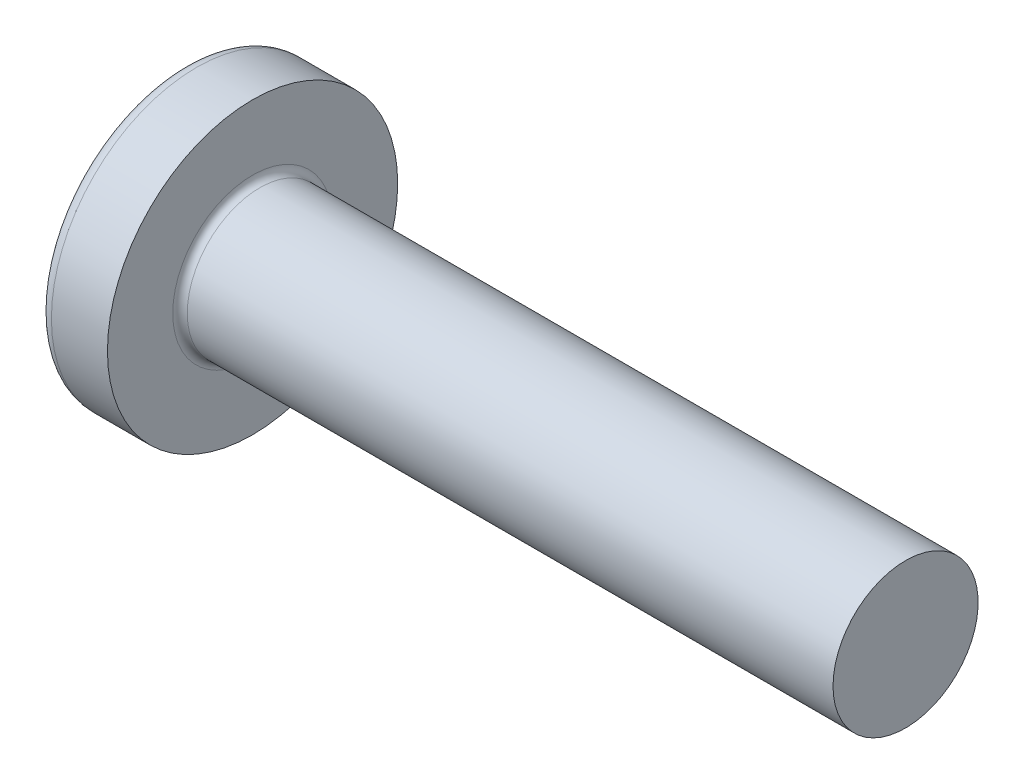
ISO-10303-21;
HEADER;
FILE_DESCRIPTION(('STEP AP214'),'2;1');
FILE_NAME('part.step','',(''),(''),'','','');
FILE_SCHEMA(('AUTOMOTIVE_DESIGN { 1 0 10303 214 1 1 1 1 }'));
ENDSEC;
DATA;
#1=APPLICATION_CONTEXT('core data for automotive mechanical design processes');
#2=APPLICATION_PROTOCOL_DEFINITION('international standard','automotive_design',2000,#1);
#3=PRODUCT_CONTEXT('',#1,'mechanical');
#4=PRODUCT('Part','Part','',(#3));
#5=PRODUCT_RELATED_PRODUCT_CATEGORY('part','',(#4));
#6=PRODUCT_DEFINITION_FORMATION('','',#4);
#7=PRODUCT_DEFINITION_CONTEXT('part definition',#1,'design');
#8=PRODUCT_DEFINITION('design','',#6,#7);
#9=PRODUCT_DEFINITION_SHAPE('','',#8);
#10=(LENGTH_UNIT() NAMED_UNIT(*) SI_UNIT(.MILLI.,.METRE.));
#11=(NAMED_UNIT(*) PLANE_ANGLE_UNIT() SI_UNIT($,.RADIAN.));
#12=(NAMED_UNIT(*) SI_UNIT($,.STERADIAN.) SOLID_ANGLE_UNIT());
#13=UNCERTAINTY_MEASURE_WITH_UNIT(LENGTH_MEASURE(1.E-05),#10,'distance_accuracy_value','');
#14=(GEOMETRIC_REPRESENTATION_CONTEXT(3) GLOBAL_UNCERTAINTY_ASSIGNED_CONTEXT((#13)) GLOBAL_UNIT_ASSIGNED_CONTEXT((#10,
#11,#12)) REPRESENTATION_CONTEXT('',''));
#15=CARTESIAN_POINT('',(0.,0.,0.));
#16=DIRECTION('',(0.,0.,1.));
#17=DIRECTION('',(1.,0.,0.));
#18=AXIS2_PLACEMENT_3D('',#15,#16,#17);
#19=CARTESIAN_POINT('',(6.5,0.,0.));
#20=DIRECTION('',(-1.,0.,0.));
#21=DIRECTION('',(0.,1.,0.));
#22=AXIS2_PLACEMENT_3D('',#19,#20,#21);
#23=SPHERICAL_SURFACE('',#22,6.5);
#24=CARTESIAN_POINT('',(1.26538895452803,0.,0.));
#25=DIRECTION('',(-1.,0.,0.));
#26=DIRECTION('',(0.,0.,1.));
#27=AXIS2_PLACEMENT_3D('',#24,#25,#26);
#28=CIRCLE('',#27,3.85342019543974);
#29=CARTESIAN_POINT('',(1.26538895452803,0.,3.85342019543974));
#30=VERTEX_POINT('',#29);
#31=EDGE_CURVE('E213',#30,#30,#28,.T.);
#32=ORIENTED_EDGE('',*,*,#31,.T.);
#33=EDGE_LOOP('',(#32));
#34=FACE_BOUND('',#33,.T.);
#35=CARTESIAN_POINT('',(0.0788099820016241,0.,0.));
#36=DIRECTION('',(1.,0.,0.));
#37=DIRECTION('',(0.,0.,-1.));
#38=AXIS2_PLACEMENT_3D('',#35,#36,#37);
#39=CIRCLE('',#38,1.0091178091571);
#40=CARTESIAN_POINT('',(0.0788099820016244,-0.514999999999996,-0.867809744562728));
#41=VERTEX_POINT('',#40);
#42=CARTESIAN_POINT('',(0.0788099820016241,-0.867809744562729,-0.515));
#43=VERTEX_POINT('',#42);
#44=EDGE_CURVE('E339',#41,#43,#39,.F.);
#45=ORIENTED_EDGE('',*,*,#44,.F.);
#46=CARTESIAN_POINT('',(6.5,-0.515000000000001,0.));
#47=DIRECTION('',(0.,1.,0.));
#48=DIRECTION('',(0.,0.,1.));
#49=AXIS2_PLACEMENT_3D('',#46,#47,#48);
#50=CIRCLE('',#49,6.47956595768575);
#51=CARTESIAN_POINT('',(0.331830520157854,-0.514999999999992,-1.98455543332603));
#52=VERTEX_POINT('',#51);
#53=EDGE_CURVE('E273',#52,#41,#50,.T.);
#54=ORIENTED_EDGE('',*,*,#53,.F.);
#55=CARTESIAN_POINT('',(6.06443225879603,0.,0.873613881878153));
#56=DIRECTION('',(0.446197753347436,0.,-0.894934391398443));
#57=DIRECTION('',(-0.894934391398442,0.,-0.446197753347436));
#58=AXIS2_PLACEMENT_3D('',#55,#56,#57);
#59=CIRCLE('',#58,6.42628038045433);
#60=CARTESIAN_POINT('',(0.331830520157856,0.515000000000007,-1.98455543332603));
#61=VERTEX_POINT('',#60);
#62=EDGE_CURVE('E247',#52,#61,#59,.T.);
#63=ORIENTED_EDGE('',*,*,#62,.T.);
#64=CARTESIAN_POINT('',(6.5,0.515,0.));
#65=DIRECTION('',(0.,-1.,0.));
#66=DIRECTION('',(0.,0.,-1.));
#67=AXIS2_PLACEMENT_3D('',#64,#65,#66);
#68=CIRCLE('',#67,6.47956595768574);
#69=CARTESIAN_POINT('',(0.0788099820016249,0.515000000000003,-0.867809744562724));
#70=VERTEX_POINT('',#69);
#71=EDGE_CURVE('E301',#70,#61,#68,.T.);
#72=ORIENTED_EDGE('',*,*,#71,.F.);
#73=CARTESIAN_POINT('',(0.0788099820016241,0.867809744562719,-0.515));
#74=VERTEX_POINT('',#73);
#75=EDGE_CURVE('E354',#74,#70,#39,.F.);
#76=ORIENTED_EDGE('',*,*,#75,.F.);
#77=CARTESIAN_POINT('',(6.5,0.,-0.515));
#78=DIRECTION('',(0.,0.,1.));
#79=DIRECTION('',(1.,0.,0.));
#80=AXIS2_PLACEMENT_3D('',#77,#78,#79);
#81=CIRCLE('',#80,6.47956595768574);
#82=CARTESIAN_POINT('',(0.331830520157856,1.98455543332603,-0.515));
#83=VERTEX_POINT('',#82);
#84=EDGE_CURVE('E241',#83,#74,#81,.T.);
#85=ORIENTED_EDGE('',*,*,#84,.F.);
#86=CARTESIAN_POINT('',(6.06443225879604,-0.873613881878154,0.));
#87=DIRECTION('',(0.446197753347436,0.894934391398443,0.));
#88=DIRECTION('',(-0.894934391398442,0.446197753347436,0.));
#89=AXIS2_PLACEMENT_3D('',#86,#87,#88);
#90=CIRCLE('',#89,6.42628038045433);
#91=CARTESIAN_POINT('',(0.331830520157857,1.98455543332603,0.515));
#92=VERTEX_POINT('',#91);
#93=EDGE_CURVE('E244',#83,#92,#90,.T.);
#94=ORIENTED_EDGE('',*,*,#93,.T.);
#95=CARTESIAN_POINT('',(6.5,0.,0.515000000000001));
#96=DIRECTION('',(0.,0.,-1.));
#97=DIRECTION('',(-1.,0.,0.));
#98=AXIS2_PLACEMENT_3D('',#95,#96,#97);
#99=CIRCLE('',#98,6.47956595768574);
#100=CARTESIAN_POINT('',(0.0788099820016241,0.867809744562719,0.514999999999999));
#101=VERTEX_POINT('',#100);
#102=EDGE_CURVE('E237',#101,#92,#99,.T.);
#103=ORIENTED_EDGE('',*,*,#102,.F.);
#104=CARTESIAN_POINT('',(0.0788099820016253,0.514999999999997,0.867809744562727));
#105=VERTEX_POINT('',#104);
#106=EDGE_CURVE('E353',#105,#101,#39,.F.);
#107=ORIENTED_EDGE('',*,*,#106,.F.);
#108=CARTESIAN_POINT('',(0.331830520157856,0.514999999999993,1.98455543332603));
#109=VERTEX_POINT('',#108);
#110=EDGE_CURVE('E257',#109,#105,#68,.T.);
#111=ORIENTED_EDGE('',*,*,#110,.F.);
#112=CARTESIAN_POINT('',(6.06443225879603,0.,-0.873613881878153));
#113=DIRECTION('',(0.446197753347436,0.,0.894934391398443));
#114=DIRECTION('',(0.894934391398442,0.,-0.446197753347436));
#115=AXIS2_PLACEMENT_3D('',#112,#113,#114);
#116=CIRCLE('',#115,6.42628038045433);
#117=CARTESIAN_POINT('',(0.331830520157855,-0.515000000000007,1.98455543332603));
#118=VERTEX_POINT('',#117);
#119=EDGE_CURVE('E48',#109,#118,#116,.T.);
#120=ORIENTED_EDGE('',*,*,#119,.T.);
#121=CARTESIAN_POINT('',(0.0788099820016247,-0.515000000000003,0.867809744562724));
#122=VERTEX_POINT('',#121);
#123=EDGE_CURVE('E254',#122,#118,#50,.T.);
#124=ORIENTED_EDGE('',*,*,#123,.F.);
#125=CARTESIAN_POINT('',(0.0788099820016241,-0.867809744562729,0.514999999999999));
#126=VERTEX_POINT('',#125);
#127=EDGE_CURVE('E385',#126,#122,#39,.F.);
#128=ORIENTED_EDGE('',*,*,#127,.F.);
#129=CARTESIAN_POINT('',(0.331830520157853,-1.98455543332603,0.514999999999999));
#130=VERTEX_POINT('',#129);
#131=EDGE_CURVE('E238',#130,#126,#99,.T.);
#132=ORIENTED_EDGE('',*,*,#131,.F.);
#133=CARTESIAN_POINT('',(6.06443225879603,0.873613881878152,0.));
#134=DIRECTION('',(0.446197753347436,-0.894934391398443,0.));
#135=DIRECTION('',(0.894934391398442,0.446197753347436,0.));
#136=AXIS2_PLACEMENT_3D('',#133,#134,#135);
#137=CIRCLE('',#136,6.42628038045433);
#138=CARTESIAN_POINT('',(0.331830520157853,-1.98455543332603,-0.515));
#139=VERTEX_POINT('',#138);
#140=EDGE_CURVE('E234',#130,#139,#137,.T.);
#141=ORIENTED_EDGE('',*,*,#140,.T.);
#142=EDGE_CURVE('E63',#43,#139,#81,.T.);
#143=ORIENTED_EDGE('',*,*,#142,.F.);
#144=EDGE_LOOP('',(#45,#54,#63,#72,#76,#85,#94,#103,#107,#111,#120,#124,#128,#132,#141,#143));
#145=FACE_BOUND('',#144,.T.);
#146=ADVANCED_FACE('F35',(#34,#145),#23,.T.);
#147=CARTESIAN_POINT('',(0.,2.15,-0.515));
#148=DIRECTION('',(0.,0.,1.));
#149=DIRECTION('',(1.,0.,0.));
#150=AXIS2_PLACEMENT_3D('',#147,#148,#149);
#151=PLANE('',#150);
#152=ORIENTED_EDGE('',*,*,#84,.T.);
#153=CARTESIAN_POINT('',(-1.51195208675156,0.994972220320188,-0.515));
#154=CARTESIAN_POINT('',(-1.20405981949279,0.970722016949958,-0.515));
#155=CARTESIAN_POINT('',(-0.896180907521174,0.946299109919651,-0.515));
#156=CARTESIAN_POINT('',(-0.280449079832185,0.896981122427851,-0.515));
#157=CARTESIAN_POINT('',(0.0274038344396873,0.872086023934883,-0.515));
#158=CARTESIAN_POINT('',(0.489146739515351,0.83429553519528,-0.515));
#159=CARTESIAN_POINT('',(0.643055047553846,0.821624058404092,-0.515));
#160=CARTESIAN_POINT('',(0.950856520197141,0.796108332639504,-0.515));
#161=CARTESIAN_POINT('',(1.10474968487868,0.783264084592465,-0.515));
#162=CARTESIAN_POINT('',(1.41251352095103,0.757376569093378,-0.515));
#163=CARTESIAN_POINT('',(1.56638419296577,0.744333309065218,-0.515));
#164=CARTESIAN_POINT('',(1.87410847343335,0.718013273188896,-0.515));
#165=CARTESIAN_POINT('',(2.02796208151372,0.704736492982792,-0.515));
#166=CARTESIAN_POINT('',(2.36455311890989,0.675386943006726,-0.515));
#167=CARTESIAN_POINT('',(2.54728562293342,0.659257575640986,-0.515));
#168=CARTESIAN_POINT('',(2.91270624109256,0.626517182479888,-0.515));
#169=CARTESIAN_POINT('',(3.09539435554038,0.609906160177238,-0.515));
#170=CARTESIAN_POINT('',(3.46069832191612,0.576073027116421,-0.515));
#171=CARTESIAN_POINT('',(3.64331417870068,0.558850968932727,-0.515));
#172=CARTESIAN_POINT('',(4.00847437496567,0.523604864540037,-0.515));
#173=CARTESIAN_POINT('',(4.19101871216888,0.505580794604253,-0.515));
#174=CARTESIAN_POINT('',(4.55606208157937,0.468429191666488,-0.515));
#175=CARTESIAN_POINT('',(4.73856107358022,0.449301262281854,-0.515));
#176=CARTESIAN_POINT('',(5.10337547353418,0.409473604748924,-0.515));
#177=CARTESIAN_POINT('',(5.28569089526422,0.388774005106069,-0.515));
#178=CARTESIAN_POINT('',(5.55897278495412,0.355828287527264,-0.515));
#179=CARTESIAN_POINT('',(5.65005277419686,0.344527918782738,-0.515));
#180=CARTESIAN_POINT('',(5.83209904103607,0.321075174263031,-0.515));
#181=CARTESIAN_POINT('',(5.92306532397915,0.308922840209686,-0.515));
#182=CARTESIAN_POINT('',(6.10486078872898,0.28342733445193,-0.515));
#183=CARTESIAN_POINT('',(6.19568992299379,0.270083817601714,-0.515));
#184=CARTESIAN_POINT('',(6.33172773785679,0.248701420809951,-0.515));
#185=CARTESIAN_POINT('',(6.37704304473344,0.241345446705304,-0.515));
#186=CARTESIAN_POINT('',(6.4675722520141,0.226018953559337,-0.515));
#187=CARTESIAN_POINT('',(6.51278614568083,0.218048394864476,-0.515));
#188=CARTESIAN_POINT('',(6.55793125759548,0.209691465274944,-0.515));
#189=B_SPLINE_CURVE_WITH_KNOTS('',3,(#153,#154,#155,#156,#157,#158,#159,#160,#161,#162,#163,
#164,#165,#166,#167,#168,#169,#170,#171,#172,#173,#174,#175,#176,#177,#178,#179,#180,#181,#182,
#183,#184,#185,#186,#187,#188),.UNSPECIFIED.,.F.,.F.,(4,2,2,2,2,2,2,2,2,2,2,2,2,2,2,2,2,4),(0.,
0.926537709781721,1.85311087258339,2.31639796016285,2.77968256468771,3.24294992902055,
3.70622594801777,4.25655436065378,4.80687878359543,5.35715597005738,5.90744944680718,
6.45794177197673,7.008389135274,7.28372117336898,7.55903973750591,7.83443833587748,
7.97216007460854,8.10989070671571),.UNSPECIFIED.);
#190=CARTESIAN_POINT('',(2.34,0.677477674908923,-0.515));
#191=VERTEX_POINT('',#190);
#192=EDGE_CURVE('E374',#74,#191,#189,.T.);
#193=ORIENTED_EDGE('',*,*,#192,.T.);
#194=DIRECTION('',(0.,1.,0.));
#195=VECTOR('',#194,1.);
#196=CARTESIAN_POINT('',(2.34,-0.983319232260742,-0.515));
#197=LINE('',#196,#195);
#198=CARTESIAN_POINT('',(2.34,0.983319232260743,-0.515));
#199=VERTEX_POINT('',#198);
#200=EDGE_CURVE('E322',#191,#199,#197,.T.);
#201=ORIENTED_EDGE('',*,*,#200,.T.);
#202=DIRECTION('',(0.894934391398442,-0.446197753347436,0.));
#203=VECTOR('',#202,1.);
#204=CARTESIAN_POINT('',(0.,2.15,-0.515));
#205=LINE('',#204,#203);
#206=EDGE_CURVE('E214',#83,#199,#205,.T.);
#207=ORIENTED_EDGE('',*,*,#206,.F.);
#208=EDGE_LOOP('',(#152,#193,#201,#207));
#209=FACE_BOUND('',#208,.T.);
#210=ADVANCED_FACE('F169',(#209),#151,.T.);
#211=CARTESIAN_POINT('',(2.34,-0.983319232260742,-0.515));
#212=VERTEX_POINT('',#211);
#213=CARTESIAN_POINT('',(2.34,-0.677477674908923,-0.515));
#214=VERTEX_POINT('',#213);
#215=EDGE_CURVE('E222',#212,#214,#197,.T.);
#216=ORIENTED_EDGE('',*,*,#215,.T.);
#217=CARTESIAN_POINT('',(-1.51195208675156,-0.994972220320188,-0.515));
#218=CARTESIAN_POINT('',(-1.20405981949279,-0.970722016949958,-0.515));
#219=CARTESIAN_POINT('',(-0.896180907521174,-0.946299109919651,-0.515));
#220=CARTESIAN_POINT('',(-0.280449079832185,-0.896981122427851,-0.515));
#221=CARTESIAN_POINT('',(0.027403834439687,-0.872086023934883,-0.515));
#222=CARTESIAN_POINT('',(0.48914673951535,-0.83429553519528,-0.515));
#223=CARTESIAN_POINT('',(0.643055047553845,-0.821624058404092,-0.515));
#224=CARTESIAN_POINT('',(0.95085652019714,-0.796108332639504,-0.515));
#225=CARTESIAN_POINT('',(1.10474968487868,-0.783264084592466,-0.515));
#226=CARTESIAN_POINT('',(1.41251352095103,-0.757376569093378,-0.515));
#227=CARTESIAN_POINT('',(1.56638419296577,-0.744333309065218,-0.515));
#228=CARTESIAN_POINT('',(1.87410847343335,-0.718013273188896,-0.515));
#229=CARTESIAN_POINT('',(2.02796208151372,-0.704736492982792,-0.515));
#230=CARTESIAN_POINT('',(2.36455311890989,-0.675386943006726,-0.515));
#231=CARTESIAN_POINT('',(2.54728562293342,-0.659257575640986,-0.515));
#232=CARTESIAN_POINT('',(2.91270624109256,-0.626517182479888,-0.515));
#233=CARTESIAN_POINT('',(3.09539435554038,-0.609906160177238,-0.515));
#234=CARTESIAN_POINT('',(3.46069832191613,-0.576073027116421,-0.515));
#235=CARTESIAN_POINT('',(3.64331417870068,-0.558850968932727,-0.515));
#236=CARTESIAN_POINT('',(4.00847437496567,-0.523604864540037,-0.515));
#237=CARTESIAN_POINT('',(4.19101871216888,-0.505580794604252,-0.515));
#238=CARTESIAN_POINT('',(4.55606208157937,-0.468429191666487,-0.515));
#239=CARTESIAN_POINT('',(4.73856107358023,-0.449301262281853,-0.515));
#240=CARTESIAN_POINT('',(5.10337547353419,-0.409473604748924,-0.515));
#241=CARTESIAN_POINT('',(5.28569089526422,-0.388774005106069,-0.515));
#242=CARTESIAN_POINT('',(5.55897278495412,-0.355828287527264,-0.515));
#243=CARTESIAN_POINT('',(5.65005277419686,-0.344527918782738,-0.515));
#244=CARTESIAN_POINT('',(5.83209904103608,-0.32107517426303,-0.515));
#245=CARTESIAN_POINT('',(5.92306532397915,-0.308922840209685,-0.515));
#246=CARTESIAN_POINT('',(6.10486078872898,-0.283427334451929,-0.515));
#247=CARTESIAN_POINT('',(6.1956899229938,-0.270083817601713,-0.515));
#248=CARTESIAN_POINT('',(6.33172773785679,-0.24870142080995,-0.515));
#249=CARTESIAN_POINT('',(6.37704304473344,-0.241345446705303,-0.515));
#250=CARTESIAN_POINT('',(6.4675722520141,-0.226018953559337,-0.515));
#251=CARTESIAN_POINT('',(6.51278614568083,-0.218048394864475,-0.515));
#252=CARTESIAN_POINT('',(6.55793125759549,-0.209691465274944,-0.515));
#253=B_SPLINE_CURVE_WITH_KNOTS('',3,(#217,#218,#219,#220,#221,#222,#223,#224,#225,#226,#227,
#228,#229,#230,#231,#232,#233,#234,#235,#236,#237,#238,#239,#240,#241,#242,#243,#244,#245,#246,
#247,#248,#249,#250,#251,#252),.UNSPECIFIED.,.F.,.F.,(4,2,2,2,2,2,2,2,2,2,2,2,2,2,2,2,2,4),(0.,
0.926537709781721,1.85311087258339,2.31639796016285,2.77968256468771,3.24294992902054,
3.70622594801777,4.25655436065378,4.80687878359543,5.35715597005738,5.90744944680718,
6.45794177197673,7.008389135274,7.28372117336899,7.55903973750591,7.83443833587749,
7.97216007460855,8.10989070671571),.UNSPECIFIED.);
#254=EDGE_CURVE('E352',#214,#43,#253,.F.);
#255=ORIENTED_EDGE('',*,*,#254,.T.);
#256=ORIENTED_EDGE('',*,*,#142,.T.);
#257=DIRECTION('',(0.894934391398442,0.446197753347436,0.));
#258=VECTOR('',#257,1.);
#259=CARTESIAN_POINT('',(0.,-2.15,-0.515));
#260=LINE('',#259,#258);
#261=EDGE_CURVE('E304',#139,#212,#260,.T.);
#262=ORIENTED_EDGE('',*,*,#261,.T.);
#263=EDGE_LOOP('',(#216,#255,#256,#262));
#264=FACE_BOUND('',#263,.T.);
#265=ADVANCED_FACE('F175',(#264),#151,.T.);
#266=CARTESIAN_POINT('',(0.,-2.15,0.514999999999999));
#267=DIRECTION('',(0.,0.,-1.));
#268=DIRECTION('',(-1.,0.,0.));
#269=AXIS2_PLACEMENT_3D('',#266,#267,#268);
#270=PLANE('',#269);
#271=DIRECTION('',(0.,-1.,0.));
#272=VECTOR('',#271,1.);
#273=CARTESIAN_POINT('',(2.34,0.983319232260742,0.515));
#274=LINE('',#273,#272);
#275=CARTESIAN_POINT('',(2.34,0.983319232260743,0.515));
#276=VERTEX_POINT('',#275);
#277=CARTESIAN_POINT('',(2.34,0.677477674908923,0.515));
#278=VERTEX_POINT('',#277);
#279=EDGE_CURVE('E312',#276,#278,#274,.T.);
#280=ORIENTED_EDGE('',*,*,#279,.T.);
#281=CARTESIAN_POINT('',(-1.51195208675156,0.994972220320188,0.514999999999999));
#282=CARTESIAN_POINT('',(-1.20405981949279,0.970722016949958,0.514999999999999));
#283=CARTESIAN_POINT('',(-0.896180907521173,0.946299109919651,0.514999999999999));
#284=CARTESIAN_POINT('',(-0.280449079832184,0.896981122427852,0.514999999999999));
#285=CARTESIAN_POINT('',(0.0274038344396879,0.872086023934883,0.514999999999999));
#286=CARTESIAN_POINT('',(0.489146739515351,0.83429553519528,0.515));
#287=CARTESIAN_POINT('',(0.643055047553846,0.821624058404092,0.515));
#288=CARTESIAN_POINT('',(0.950856520197141,0.796108332639504,0.515));
#289=CARTESIAN_POINT('',(1.10474968487868,0.783264084592466,0.515));
#290=CARTESIAN_POINT('',(1.41251352095103,0.757376569093379,0.515));
#291=CARTESIAN_POINT('',(1.56638419296577,0.744333309065218,0.515));
#292=CARTESIAN_POINT('',(1.87410847343335,0.718013273188896,0.515));
#293=CARTESIAN_POINT('',(2.02796208151372,0.704736492982792,0.515));
#294=CARTESIAN_POINT('',(2.36455311890989,0.675386943006726,0.515));
#295=CARTESIAN_POINT('',(2.54728562293342,0.659257575640986,0.515));
#296=CARTESIAN_POINT('',(2.91270624109256,0.626517182479888,0.515));
#297=CARTESIAN_POINT('',(3.09539435554038,0.609906160177238,0.515));
#298=CARTESIAN_POINT('',(3.46069832191613,0.576073027116421,0.515));
#299=CARTESIAN_POINT('',(3.64331417870068,0.558850968932727,0.515));
#300=CARTESIAN_POINT('',(4.00847437496567,0.523604864540037,0.515));
#301=CARTESIAN_POINT('',(4.19101871216888,0.505580794604252,0.515));
#302=CARTESIAN_POINT('',(4.55606208157937,0.468429191666487,0.515));
#303=CARTESIAN_POINT('',(4.73856107358023,0.449301262281853,0.515000000000001));
#304=CARTESIAN_POINT('',(5.10337547353419,0.409473604748924,0.515000000000001));
#305=CARTESIAN_POINT('',(5.28569089526422,0.388774005106069,0.515000000000001));
#306=CARTESIAN_POINT('',(5.55897278495412,0.355828287527263,0.515000000000001));
#307=CARTESIAN_POINT('',(5.65005277419686,0.344527918782737,0.515000000000001));
#308=CARTESIAN_POINT('',(5.83209904103608,0.32107517426303,0.515000000000001));
#309=CARTESIAN_POINT('',(5.92306532397915,0.308922840209685,0.515000000000001));
#310=CARTESIAN_POINT('',(6.10486078872898,0.283427334451929,0.515000000000001));
#311=CARTESIAN_POINT('',(6.1956899229938,0.270083817601713,0.515000000000001));
#312=CARTESIAN_POINT('',(6.33172773785679,0.248701420809949,0.515000000000001));
#313=CARTESIAN_POINT('',(6.37704304473344,0.241345446705302,0.515000000000001));
#314=CARTESIAN_POINT('',(6.4675722520141,0.226018953559336,0.515000000000001));
#315=CARTESIAN_POINT('',(6.51278614568083,0.218048394864474,0.515000000000001));
#316=CARTESIAN_POINT('',(6.55793125759549,0.209691465274942,0.515000000000001));
#317=B_SPLINE_CURVE_WITH_KNOTS('',3,(#281,#282,#283,#284,#285,#286,#287,#288,#289,#290,#291,
#292,#293,#294,#295,#296,#297,#298,#299,#300,#301,#302,#303,#304,#305,#306,#307,#308,#309,#310,
#311,#312,#313,#314,#315,#316),.UNSPECIFIED.,.F.,.F.,(4,2,2,2,2,2,2,2,2,2,2,2,2,2,2,2,2,4),(0.,
0.926537709781721,1.85311087258339,2.31639796016285,2.77968256468771,3.24294992902054,
3.70622594801777,4.25655436065378,4.80687878359543,5.35715597005738,5.90744944680718,
6.45794177197673,7.008389135274,7.28372117336899,7.55903973750591,7.83443833587749,
7.97216007460855,8.10989070671571),.UNSPECIFIED.);
#318=EDGE_CURVE('E278',#278,#101,#317,.F.);
#319=ORIENTED_EDGE('',*,*,#318,.T.);
#320=ORIENTED_EDGE('',*,*,#102,.T.);
#321=DIRECTION('',(0.894934391398442,-0.446197753347436,0.));
#322=VECTOR('',#321,1.);
#323=CARTESIAN_POINT('',(0.,2.15,0.515));
#324=LINE('',#323,#322);
#325=EDGE_CURVE('E219',#92,#276,#324,.T.);
#326=ORIENTED_EDGE('',*,*,#325,.T.);
#327=EDGE_LOOP('',(#280,#319,#320,#326));
#328=FACE_BOUND('',#327,.T.);
#329=ADVANCED_FACE('F370',(#328),#270,.T.);
#330=ORIENTED_EDGE('',*,*,#131,.T.);
#331=CARTESIAN_POINT('',(-1.51195208675156,-0.994972220320188,0.514999999999999));
#332=CARTESIAN_POINT('',(-1.20405981949279,-0.970722016949958,0.514999999999999));
#333=CARTESIAN_POINT('',(-0.896180907521174,-0.946299109919651,0.514999999999999));
#334=CARTESIAN_POINT('',(-0.280449079832185,-0.896981122427852,0.514999999999999));
#335=CARTESIAN_POINT('',(0.0274038344396874,-0.872086023934883,0.514999999999999));
#336=CARTESIAN_POINT('',(0.489146739515351,-0.83429553519528,0.514999999999999));
#337=CARTESIAN_POINT('',(0.643055047553846,-0.821624058404092,0.514999999999999));
#338=CARTESIAN_POINT('',(0.950856520197141,-0.796108332639504,0.514999999999999));
#339=CARTESIAN_POINT('',(1.10474968487868,-0.783264084592466,0.515));
#340=CARTESIAN_POINT('',(1.41251352095103,-0.757376569093379,0.515));
#341=CARTESIAN_POINT('',(1.56638419296577,-0.744333309065218,0.515));
#342=CARTESIAN_POINT('',(1.87410847343335,-0.718013273188896,0.515));
#343=CARTESIAN_POINT('',(2.02796208151372,-0.704736492982792,0.515));
#344=CARTESIAN_POINT('',(2.36455311890989,-0.675386943006726,0.515));
#345=CARTESIAN_POINT('',(2.54728562293342,-0.659257575640986,0.515));
#346=CARTESIAN_POINT('',(2.91270624109256,-0.626517182479888,0.515));
#347=CARTESIAN_POINT('',(3.09539435554038,-0.609906160177238,0.515));
#348=CARTESIAN_POINT('',(3.46069832191613,-0.576073027116421,0.515));
#349=CARTESIAN_POINT('',(3.64331417870068,-0.558850968932727,0.515));
#350=CARTESIAN_POINT('',(4.00847437496567,-0.523604864540037,0.515));
#351=CARTESIAN_POINT('',(4.19101871216888,-0.505580794604253,0.515));
#352=CARTESIAN_POINT('',(4.55606208157937,-0.468429191666487,0.515));
#353=CARTESIAN_POINT('',(4.73856107358022,-0.449301262281853,0.515));
#354=CARTESIAN_POINT('',(5.10337547353418,-0.409473604748924,0.515));
#355=CARTESIAN_POINT('',(5.28569089526422,-0.388774005106069,0.515));
#356=CARTESIAN_POINT('',(5.55897278495412,-0.355828287527263,0.515000000000001));
#357=CARTESIAN_POINT('',(5.65005277419686,-0.344527918782738,0.515000000000001));
#358=CARTESIAN_POINT('',(5.83209904103607,-0.32107517426303,0.515000000000001));
#359=CARTESIAN_POINT('',(5.92306532397915,-0.308922840209685,0.515000000000001));
#360=CARTESIAN_POINT('',(6.10486078872898,-0.283427334451929,0.515000000000001));
#361=CARTESIAN_POINT('',(6.19568992299379,-0.270083817601713,0.515000000000001));
#362=CARTESIAN_POINT('',(6.33172773785679,-0.24870142080995,0.515000000000001));
#363=CARTESIAN_POINT('',(6.37704304473344,-0.241345446705303,0.515000000000001));
#364=CARTESIAN_POINT('',(6.4675722520141,-0.226018953559336,0.515000000000001));
#365=CARTESIAN_POINT('',(6.51278614568083,-0.218048394864474,0.515000000000001));
#366=CARTESIAN_POINT('',(6.55793125759549,-0.209691465274943,0.515000000000001));
#367=B_SPLINE_CURVE_WITH_KNOTS('',3,(#331,#332,#333,#334,#335,#336,#337,#338,#339,#340,#341,
#342,#343,#344,#345,#346,#347,#348,#349,#350,#351,#352,#353,#354,#355,#356,#357,#358,#359,#360,
#361,#362,#363,#364,#365,#366),.UNSPECIFIED.,.F.,.F.,(4,2,2,2,2,2,2,2,2,2,2,2,2,2,2,2,2,4),(0.,
0.926537709781721,1.85311087258339,2.31639796016285,2.77968256468771,3.24294992902055,
3.70622594801777,4.25655436065378,4.80687878359543,5.35715597005738,5.90744944680718,
6.45794177197673,7.008389135274,7.28372117336899,7.55903973750591,7.83443833587748,
7.97216007460854,8.10989070671571),.UNSPECIFIED.);
#368=CARTESIAN_POINT('',(2.34,-0.677477674908923,0.515));
#369=VERTEX_POINT('',#368);
#370=EDGE_CURVE('E386',#126,#369,#367,.T.);
#371=ORIENTED_EDGE('',*,*,#370,.T.);
#372=CARTESIAN_POINT('',(2.34,-0.983319232260743,0.515));
#373=VERTEX_POINT('',#372);
#374=EDGE_CURVE('E314',#369,#373,#274,.T.);
#375=ORIENTED_EDGE('',*,*,#374,.T.);
#376=DIRECTION('',(0.894934391398443,0.446197753347436,0.));
#377=VECTOR('',#376,1.);
#378=CARTESIAN_POINT('',(0.,-2.15,0.514999999999999));
#379=LINE('',#378,#377);
#380=EDGE_CURVE('E306',#130,#373,#379,.T.);
#381=ORIENTED_EDGE('',*,*,#380,.F.);
#382=EDGE_LOOP('',(#330,#371,#375,#381));
#383=FACE_BOUND('',#382,.T.);
#384=ADVANCED_FACE('F413',(#383),#270,.T.);
#385=CARTESIAN_POINT('',(2.34,0.983319232260742,-0.515));
#386=DIRECTION('',(-1.,0.,0.));
#387=DIRECTION('',(0.,0.,1.));
#388=AXIS2_PLACEMENT_3D('',#385,#386,#387);
#389=PLANE('',#388);
#390=ORIENTED_EDGE('',*,*,#374,.F.);
#391=CARTESIAN_POINT('',(2.34,0.,0.));
#392=DIRECTION('',(-1.,0.,0.));
#393=DIRECTION('',(0.,0.,1.));
#394=AXIS2_PLACEMENT_3D('',#391,#392,#393);
#395=CIRCLE('',#394,0.851);
#396=EDGE_CURVE('E347',#214,#369,#395,.T.);
#397=ORIENTED_EDGE('',*,*,#396,.F.);
#398=ORIENTED_EDGE('',*,*,#215,.F.);
#399=DIRECTION('',(0.,0.,1.));
#400=VECTOR('',#399,1.);
#401=CARTESIAN_POINT('',(2.34,-0.983319232260742,-0.515));
#402=LINE('',#401,#400);
#403=EDGE_CURVE('E309',#212,#373,#402,.T.);
#404=ORIENTED_EDGE('',*,*,#403,.T.);
#405=EDGE_LOOP('',(#390,#397,#398,#404));
#406=FACE_BOUND('',#405,.T.);
#407=ADVANCED_FACE('F411',(#406),#389,.T.);
#408=DIRECTION('',(0.,0.,-1.));
#409=VECTOR('',#408,1.);
#410=CARTESIAN_POINT('',(2.34,-0.515000000000004,0.983319232260741));
#411=LINE('',#410,#409);
#412=CARTESIAN_POINT('',(2.34,-0.514999999999997,-0.677477674908925));
#413=VERTEX_POINT('',#412);
#414=CARTESIAN_POINT('',(2.34,-0.514999999999996,-0.983319232260744));
#415=VERTEX_POINT('',#414);
#416=EDGE_CURVE('E295',#413,#415,#411,.T.);
#417=ORIENTED_EDGE('',*,*,#416,.F.);
#418=CARTESIAN_POINT('',(2.34,0.515000000000003,-0.677477674908921));
#419=VERTEX_POINT('',#418);
#420=EDGE_CURVE('E55',#419,#413,#395,.T.);
#421=ORIENTED_EDGE('',*,*,#420,.F.);
#422=DIRECTION('',(0.,0.,1.));
#423=VECTOR('',#422,1.);
#424=CARTESIAN_POINT('',(2.34,0.515000000000004,-0.983319232260741));
#425=LINE('',#424,#423);
#426=CARTESIAN_POINT('',(2.34,0.515000000000004,-0.983319232260741));
#427=VERTEX_POINT('',#426);
#428=EDGE_CURVE('E298',#427,#419,#425,.T.);
#429=ORIENTED_EDGE('',*,*,#428,.F.);
#430=DIRECTION('',(0.,-1.,0.));
#431=VECTOR('',#430,1.);
#432=CARTESIAN_POINT('',(2.34,0.515000000000004,-0.983319232260741));
#433=LINE('',#432,#431);
#434=EDGE_CURVE('E289',#427,#415,#433,.T.);
#435=ORIENTED_EDGE('',*,*,#434,.T.);
#436=EDGE_LOOP('',(#417,#421,#429,#435));
#437=FACE_BOUND('',#436,.T.);
#438=ADVANCED_FACE('F342',(#437),#389,.T.);
#439=ORIENTED_EDGE('',*,*,#200,.F.);
#440=EDGE_CURVE('E346',#278,#191,#395,.T.);
#441=ORIENTED_EDGE('',*,*,#440,.F.);
#442=ORIENTED_EDGE('',*,*,#279,.F.);
#443=DIRECTION('',(0.,0.,-1.));
#444=VECTOR('',#443,1.);
#445=CARTESIAN_POINT('',(2.34,0.983319232260742,0.515));
#446=LINE('',#445,#444);
#447=EDGE_CURVE('E315',#276,#199,#446,.T.);
#448=ORIENTED_EDGE('',*,*,#447,.T.);
#449=EDGE_LOOP('',(#439,#441,#442,#448));
#450=FACE_BOUND('',#449,.T.);
#451=ADVANCED_FACE('F420',(#450),#389,.T.);
#452=CARTESIAN_POINT('',(2.34,0.514999999999998,0.677477674908924));
#453=VERTEX_POINT('',#452);
#454=CARTESIAN_POINT('',(2.34,0.514999999999997,0.983319232260744));
#455=VERTEX_POINT('',#454);
#456=EDGE_CURVE('E271',#453,#455,#425,.T.);
#457=ORIENTED_EDGE('',*,*,#456,.F.);
#458=CARTESIAN_POINT('',(2.34,-0.515000000000003,0.677477674908921));
#459=VERTEX_POINT('',#458);
#460=EDGE_CURVE('E350',#459,#453,#395,.T.);
#461=ORIENTED_EDGE('',*,*,#460,.F.);
#462=CARTESIAN_POINT('',(2.34,-0.515000000000004,0.983319232260741));
#463=VERTEX_POINT('',#462);
#464=EDGE_CURVE('E292',#463,#459,#411,.T.);
#465=ORIENTED_EDGE('',*,*,#464,.F.);
#466=DIRECTION('',(0.,1.,0.));
#467=VECTOR('',#466,1.);
#468=CARTESIAN_POINT('',(2.34,-0.515000000000004,0.983319232260741));
#469=LINE('',#468,#467);
#470=EDGE_CURVE('E296',#463,#455,#469,.T.);
#471=ORIENTED_EDGE('',*,*,#470,.T.);
#472=EDGE_LOOP('',(#457,#461,#465,#471));
#473=FACE_BOUND('',#472,.T.);
#474=ADVANCED_FACE('F415',(#473),#389,.T.);
#475=CARTESIAN_POINT('',(0.,0.514999999999993,2.15));
#476=DIRECTION('',(0.,-1.,0.));
#477=DIRECTION('',(1.,0.,0.));
#478=AXIS2_PLACEMENT_3D('',#475,#476,#477);
#479=PLANE('',#478);
#480=ORIENTED_EDGE('',*,*,#110,.T.);
#481=CARTESIAN_POINT('',(-1.51195208675156,0.514999999999997,0.994972220320189));
#482=CARTESIAN_POINT('',(-1.20405981949279,0.514999999999997,0.97072201694996));
#483=CARTESIAN_POINT('',(-0.896180907521173,0.514999999999997,0.946299109919652));
#484=CARTESIAN_POINT('',(-0.280449079832184,0.514999999999997,0.896981122427853));
#485=CARTESIAN_POINT('',(0.0274038344396879,0.514999999999997,0.872086023934884));
#486=CARTESIAN_POINT('',(0.489146739515351,0.514999999999997,0.834295535195282));
#487=CARTESIAN_POINT('',(0.643055047553846,0.514999999999997,0.821624058404094));
#488=CARTESIAN_POINT('',(0.950856520197141,0.514999999999997,0.796108332639506));
#489=CARTESIAN_POINT('',(1.10474968487868,0.514999999999997,0.783264084592467));
#490=CARTESIAN_POINT('',(1.41251352095103,0.514999999999997,0.75737656909338));
#491=CARTESIAN_POINT('',(1.56638419296577,0.514999999999997,0.74433330906522));
#492=CARTESIAN_POINT('',(1.87410847343335,0.514999999999998,0.718013273188897));
#493=CARTESIAN_POINT('',(2.02796208151372,0.514999999999998,0.704736492982794));
#494=CARTESIAN_POINT('',(2.36455311890989,0.514999999999998,0.675386943006728));
#495=CARTESIAN_POINT('',(2.54728562293342,0.514999999999998,0.659257575640987));
#496=CARTESIAN_POINT('',(2.91270624109256,0.514999999999998,0.626517182479889));
#497=CARTESIAN_POINT('',(3.09539435554038,0.514999999999998,0.60990616017724));
#498=CARTESIAN_POINT('',(3.46069832191613,0.514999999999998,0.576073027116423));
#499=CARTESIAN_POINT('',(3.64331417870068,0.514999999999998,0.558850968932729));
#500=CARTESIAN_POINT('',(4.00847437496567,0.514999999999998,0.523604864540039));
#501=CARTESIAN_POINT('',(4.19101871216888,0.514999999999998,0.505580794604254));
#502=CARTESIAN_POINT('',(4.55606208157937,0.514999999999999,0.468429191666489));
#503=CARTESIAN_POINT('',(4.73856107358023,0.514999999999999,0.449301262281855));
#504=CARTESIAN_POINT('',(5.10337547353419,0.514999999999999,0.409473604748926));
#505=CARTESIAN_POINT('',(5.28569089526422,0.514999999999999,0.388774005106071));
#506=CARTESIAN_POINT('',(5.55897278495412,0.514999999999999,0.355828287527265));
#507=CARTESIAN_POINT('',(5.65005277419686,0.514999999999999,0.344527918782739));
#508=CARTESIAN_POINT('',(5.83209904103608,0.514999999999999,0.321075174263032));
#509=CARTESIAN_POINT('',(5.92306532397915,0.514999999999999,0.308922840209687));
#510=CARTESIAN_POINT('',(6.10486078872898,0.514999999999999,0.283427334451931));
#511=CARTESIAN_POINT('',(6.19568992299379,0.514999999999999,0.270083817601715));
#512=CARTESIAN_POINT('',(6.33172773785679,0.514999999999999,0.248701420809952));
#513=CARTESIAN_POINT('',(6.37704304473344,0.514999999999999,0.241345446705305));
#514=CARTESIAN_POINT('',(6.4675722520141,0.514999999999999,0.226018953559339));
#515=CARTESIAN_POINT('',(6.51278614568083,0.514999999999999,0.218048394864478));
#516=CARTESIAN_POINT('',(6.55793125759549,0.515,0.209691465274946));
#517=B_SPLINE_CURVE_WITH_KNOTS('',3,(#481,#482,#483,#484,#485,#486,#487,#488,#489,#490,#491,
#492,#493,#494,#495,#496,#497,#498,#499,#500,#501,#502,#503,#504,#505,#506,#507,#508,#509,#510,
#511,#512,#513,#514,#515,#516),.UNSPECIFIED.,.F.,.F.,(4,2,2,2,2,2,2,2,2,2,2,2,2,2,2,2,2,4),(0.,
0.926537709781721,1.85311087258339,2.31639796016285,2.77968256468771,3.24294992902054,
3.70622594801777,4.25655436065378,4.80687878359543,5.35715597005738,5.90744944680718,
6.45794177197673,7.008389135274,7.28372117336899,7.55903973750591,7.83443833587748,
7.97216007460854,8.10989070671571),.UNSPECIFIED.);
#518=EDGE_CURVE('E434',#105,#453,#517,.T.);
#519=ORIENTED_EDGE('',*,*,#518,.T.);
#520=ORIENTED_EDGE('',*,*,#456,.T.);
#521=DIRECTION('',(0.894934391398442,0.,-0.446197753347436));
#522=VECTOR('',#521,1.);
#523=CARTESIAN_POINT('',(0.,0.514999999999993,2.15));
#524=LINE('',#523,#522);
#525=EDGE_CURVE('E264',#109,#455,#524,.T.);
#526=ORIENTED_EDGE('',*,*,#525,.F.);
#527=EDGE_LOOP('',(#480,#519,#520,#526));
#528=FACE_BOUND('',#527,.T.);
#529=ADVANCED_FACE('F268',(#528),#479,.T.);
#530=CARTESIAN_POINT('',(0.,-0.514999999999992,-2.15));
#531=DIRECTION('',(0.,1.,0.));
#532=DIRECTION('',(-1.,0.,0.));
#533=AXIS2_PLACEMENT_3D('',#530,#531,#532);
#534=PLANE('',#533);
#535=ORIENTED_EDGE('',*,*,#464,.T.);
#536=CARTESIAN_POINT('',(-1.51195208754037,-0.515000000000003,0.994972220382296));
#537=CARTESIAN_POINT('',(-1.20405982018868,-0.515000000000003,0.970722017005062));
#538=CARTESIAN_POINT('',(-0.896180908124144,-0.515000000000003,0.946299109967687));
#539=CARTESIAN_POINT('',(-0.280449080249313,-0.515000000000003,0.896981122461526));
#540=CARTESIAN_POINT('',(0.027403834115485,-0.515000000000003,0.872086023961263));
#541=CARTESIAN_POINT('',(0.489146739371409,-0.515000000000003,0.834295535207135));
#542=CARTESIAN_POINT('',(0.643055047497245,-0.515000000000003,0.821624058408794));
#543=CARTESIAN_POINT('',(0.950856520315204,-0.515000000000003,0.796108332629704));
#544=CARTESIAN_POINT('',(1.10474968508407,-0.515000000000003,0.783264084575316));
#545=CARTESIAN_POINT('',(1.41251352133103,-0.515000000000003,0.757376569061286));
#546=CARTESIAN_POINT('',(1.56638419343305,-0.515000000000003,0.744333309025532));
#547=CARTESIAN_POINT('',(1.87410847407519,-0.515000000000003,0.718013273133714));
#548=CARTESIAN_POINT('',(2.02796208224283,-0.515000000000002,0.704736492919708));
#549=CARTESIAN_POINT('',(2.36455311972626,-0.515000000000002,0.675386942934954));
#550=CARTESIAN_POINT('',(2.5472856237498,-0.515000000000002,0.659257575568566));
#551=CARTESIAN_POINT('',(2.91270624190895,-0.515000000000002,0.626517182406012));
#552=CARTESIAN_POINT('',(3.09539435635676,-0.515000000000002,0.609906160102553));
#553=CARTESIAN_POINT('',(3.46069832273244,-0.515000000000002,0.576073027039887));
#554=CARTESIAN_POINT('',(3.64331417951694,-0.515000000000002,0.558850968855155));
#555=CARTESIAN_POINT('',(4.00847437578178,-0.515000000000002,0.523604864460042));
#556=CARTESIAN_POINT('',(4.1910187129849,-0.515000000000002,0.505580794522874));
#557=CARTESIAN_POINT('',(4.55606208239526,-0.515000000000002,0.468429191581778));
#558=CARTESIAN_POINT('',(4.73856107439606,-0.515000000000002,0.449301262195196));
#559=CARTESIAN_POINT('',(5.10337547434977,-0.515000000000002,0.409473604657433));
#560=CARTESIAN_POINT('',(5.28569089607961,-0.515000000000002,0.388774005011692));
#561=CARTESIAN_POINT('',(5.55897278576906,-0.515000000000002,0.35582828742708));
#562=CARTESIAN_POINT('',(5.65005277501166,-0.515000000000002,0.344527918680366));
#563=CARTESIAN_POINT('',(5.83209904185046,-0.515000000000002,0.321075174155497));
#564=CARTESIAN_POINT('',(5.92306532479326,-0.515000000000002,0.308922840099178));
#565=CARTESIAN_POINT('',(6.10486078954238,-0.515000000000002,0.28342733433415));
#566=CARTESIAN_POINT('',(6.19568992380676,-0.515000000000002,0.270083817479634));
#567=CARTESIAN_POINT('',(6.33172773866873,-0.515000000000002,0.248701420679476));
#568=CARTESIAN_POINT('',(6.37704304554499,-0.515000000000002,0.241345446571704));
#569=CARTESIAN_POINT('',(6.46757225282465,-0.515000000000002,0.22601895341842));
#570=CARTESIAN_POINT('',(6.51278614649077,-0.515000000000002,0.218048394719365));
#571=CARTESIAN_POINT('',(6.55793125840465,-0.515000000000002,0.209691465124898));
#572=B_SPLINE_CURVE_WITH_KNOTS('',3,(#536,#537,#538,#539,#540,#541,#542,#543,#544,#545,#546,
#547,#548,#549,#550,#551,#552,#553,#554,#555,#556,#557,#558,#559,#560,#561,#562,#563,#564,#565,
#566,#567,#568,#569,#570,#571),.UNSPECIFIED.,.F.,.F.,(4,2,2,2,2,2,2,2,2,2,2,2,2,2,2,2,2,4),(0.,
0.926537710061278,1.85311087314258,2.31639796098494,2.77968256577269,3.24294993036838,
3.70622594962848,4.25655436226469,4.80687878520654,5.3571559716686,5.90744944841854,
6.45794177358856,7.00838913688618,7.28372117498157,7.55903973911884,7.83443833749096,
7.97216007622236,8.10989070832989),.UNSPECIFIED.);
#573=EDGE_CURVE('E379',#459,#122,#572,.F.);
#574=ORIENTED_EDGE('',*,*,#573,.T.);
#575=ORIENTED_EDGE('',*,*,#123,.T.);
#576=DIRECTION('',(0.894934391398442,0.,-0.446197753347436));
#577=VECTOR('',#576,1.);
#578=CARTESIAN_POINT('',(0.,-0.515000000000007,2.15));
#579=LINE('',#578,#577);
#580=EDGE_CURVE('E266',#118,#463,#579,.T.);
#581=ORIENTED_EDGE('',*,*,#580,.T.);
#582=EDGE_LOOP('',(#535,#574,#575,#581));
#583=FACE_BOUND('',#582,.T.);
#584=ADVANCED_FACE('F204',(#583),#534,.T.);
#585=ORIENTED_EDGE('',*,*,#428,.T.);
#586=CARTESIAN_POINT('',(-1.51195208754037,0.515000000000004,-0.994972220382296));
#587=CARTESIAN_POINT('',(-1.20405982018868,0.515000000000003,-0.970722017005062));
#588=CARTESIAN_POINT('',(-0.896180908124144,0.515000000000003,-0.946299109967687));
#589=CARTESIAN_POINT('',(-0.280449080249312,0.515000000000003,-0.896981122461525));
#590=CARTESIAN_POINT('',(0.0274038341154851,0.515000000000003,-0.872086023961263));
#591=CARTESIAN_POINT('',(0.489146739371408,0.515000000000003,-0.834295535207134));
#592=CARTESIAN_POINT('',(0.643055047497245,0.515000000000003,-0.821624058408794));
#593=CARTESIAN_POINT('',(0.950856520315203,0.515000000000003,-0.796108332629704));
#594=CARTESIAN_POINT('',(1.10474968508407,0.515000000000003,-0.783264084575316));
#595=CARTESIAN_POINT('',(1.41251352133103,0.515000000000003,-0.757376569061286));
#596=CARTESIAN_POINT('',(1.56638419343305,0.515000000000003,-0.744333309025532));
#597=CARTESIAN_POINT('',(1.87410847407519,0.515000000000003,-0.718013273133714));
#598=CARTESIAN_POINT('',(2.02796208224283,0.515000000000003,-0.704736492919708));
#599=CARTESIAN_POINT('',(2.36455311972626,0.515000000000002,-0.675386942934954));
#600=CARTESIAN_POINT('',(2.5472856237498,0.515000000000002,-0.659257575568566));
#601=CARTESIAN_POINT('',(2.91270624190895,0.515000000000002,-0.626517182406012));
#602=CARTESIAN_POINT('',(3.09539435635676,0.515000000000002,-0.609906160102552));
#603=CARTESIAN_POINT('',(3.46069832273244,0.515000000000002,-0.576073027039887));
#604=CARTESIAN_POINT('',(3.64331417951694,0.515000000000002,-0.558850968855155));
#605=CARTESIAN_POINT('',(4.00847437578178,0.515000000000002,-0.523604864460042));
#606=CARTESIAN_POINT('',(4.1910187129849,0.515000000000002,-0.505580794522874));
#607=CARTESIAN_POINT('',(4.55606208239526,0.515000000000002,-0.468429191581778));
#608=CARTESIAN_POINT('',(4.73856107439606,0.515000000000002,-0.449301262195196));
#609=CARTESIAN_POINT('',(5.10337547434977,0.515000000000002,-0.409473604657433));
#610=CARTESIAN_POINT('',(5.28569089607961,0.515000000000002,-0.388774005011693));
#611=CARTESIAN_POINT('',(5.55897278576906,0.515000000000002,-0.35582828742708));
#612=CARTESIAN_POINT('',(5.65005277501166,0.515000000000001,-0.344527918680367));
#613=CARTESIAN_POINT('',(5.83209904185046,0.515000000000001,-0.321075174155498));
#614=CARTESIAN_POINT('',(5.92306532479326,0.515000000000001,-0.308922840099179));
#615=CARTESIAN_POINT('',(6.10486078954238,0.515000000000001,-0.283427334334151));
#616=CARTESIAN_POINT('',(6.19568992380675,0.515000000000001,-0.270083817479635));
#617=CARTESIAN_POINT('',(6.33172773866873,0.515000000000001,-0.248701420679477));
#618=CARTESIAN_POINT('',(6.37704304554499,0.515000000000001,-0.241345446571705));
#619=CARTESIAN_POINT('',(6.46757225282465,0.515000000000001,-0.226018953418421));
#620=CARTESIAN_POINT('',(6.51278614649077,0.515000000000001,-0.218048394719367));
#621=CARTESIAN_POINT('',(6.55793125840465,0.515000000000001,-0.209691465124899));
#622=B_SPLINE_CURVE_WITH_KNOTS('',3,(#586,#587,#588,#589,#590,#591,#592,#593,#594,#595,#596,
#597,#598,#599,#600,#601,#602,#603,#604,#605,#606,#607,#608,#609,#610,#611,#612,#613,#614,#615,
#616,#617,#618,#619,#620,#621),.UNSPECIFIED.,.F.,.F.,(4,2,2,2,2,2,2,2,2,2,2,2,2,2,2,2,2,4),(0.,
0.926537710061278,1.85311087314258,2.31639796098494,2.77968256577269,3.24294993036838,
3.70622594962848,4.25655436226469,4.80687878520654,5.3571559716686,5.90744944841855,
6.45794177358856,7.00838913688618,7.28372117498156,7.55903973911884,7.83443833749096,
7.97216007622236,8.10989070832989),.UNSPECIFIED.);
#623=EDGE_CURVE('E331',#419,#70,#622,.F.);
#624=ORIENTED_EDGE('',*,*,#623,.T.);
#625=ORIENTED_EDGE('',*,*,#71,.T.);
#626=DIRECTION('',(0.894934391398442,0.,0.446197753347436));
#627=VECTOR('',#626,1.);
#628=CARTESIAN_POINT('',(0.,0.515000000000008,-2.15));
#629=LINE('',#628,#627);
#630=EDGE_CURVE('E275',#61,#427,#629,.T.);
#631=ORIENTED_EDGE('',*,*,#630,.T.);
#632=EDGE_LOOP('',(#585,#624,#625,#631));
#633=FACE_BOUND('',#632,.T.);
#634=ADVANCED_FACE('F202',(#633),#479,.T.);
#635=ORIENTED_EDGE('',*,*,#53,.T.);
#636=CARTESIAN_POINT('',(-1.51195208675156,-0.514999999999996,-0.99497222032019));
#637=CARTESIAN_POINT('',(-1.20405981949279,-0.514999999999996,-0.97072201694996));
#638=CARTESIAN_POINT('',(-0.896180907521174,-0.514999999999996,-0.946299109919653));
#639=CARTESIAN_POINT('',(-0.280449079832186,-0.514999999999996,-0.896981122427854));
#640=CARTESIAN_POINT('',(0.0274038344396869,-0.514999999999996,-0.872086023934885));
#641=CARTESIAN_POINT('',(0.48914673951535,-0.514999999999997,-0.834295535195282));
#642=CARTESIAN_POINT('',(0.643055047553845,-0.514999999999997,-0.821624058404094));
#643=CARTESIAN_POINT('',(0.95085652019714,-0.514999999999997,-0.796108332639506));
#644=CARTESIAN_POINT('',(1.10474968487868,-0.514999999999997,-0.783264084592468));
#645=CARTESIAN_POINT('',(1.41251352095103,-0.514999999999997,-0.757376569093381));
#646=CARTESIAN_POINT('',(1.56638419296577,-0.514999999999997,-0.74433330906522));
#647=CARTESIAN_POINT('',(1.87410847343335,-0.514999999999997,-0.718013273188898));
#648=CARTESIAN_POINT('',(2.02796208151372,-0.514999999999997,-0.704736492982794));
#649=CARTESIAN_POINT('',(2.36455311890989,-0.514999999999998,-0.675386943006728));
#650=CARTESIAN_POINT('',(2.54728562293342,-0.514999999999998,-0.659257575640988));
#651=CARTESIAN_POINT('',(2.91270624109256,-0.514999999999998,-0.62651718247989));
#652=CARTESIAN_POINT('',(3.09539435554038,-0.514999999999998,-0.60990616017724));
#653=CARTESIAN_POINT('',(3.46069832191612,-0.514999999999998,-0.576073027116423));
#654=CARTESIAN_POINT('',(3.64331417870068,-0.514999999999998,-0.558850968932729));
#655=CARTESIAN_POINT('',(4.00847437496567,-0.514999999999998,-0.523604864540039));
#656=CARTESIAN_POINT('',(4.19101871216888,-0.514999999999999,-0.505580794604254));
#657=CARTESIAN_POINT('',(4.55606208157937,-0.514999999999999,-0.468429191666489));
#658=CARTESIAN_POINT('',(4.73856107358022,-0.514999999999999,-0.449301262281855));
#659=CARTESIAN_POINT('',(5.10337547353418,-0.514999999999999,-0.409473604748926));
#660=CARTESIAN_POINT('',(5.28569089526422,-0.514999999999999,-0.388774005106071));
#661=CARTESIAN_POINT('',(5.55897278495412,-0.514999999999999,-0.355828287527265));
#662=CARTESIAN_POINT('',(5.65005277419686,-0.514999999999999,-0.34452791878274));
#663=CARTESIAN_POINT('',(5.83209904103607,-0.515,-0.321075174263032));
#664=CARTESIAN_POINT('',(5.92306532397915,-0.515,-0.308922840209687));
#665=CARTESIAN_POINT('',(6.10486078872898,-0.515,-0.283427334451931));
#666=CARTESIAN_POINT('',(6.19568992299379,-0.515,-0.270083817601715));
#667=CARTESIAN_POINT('',(6.33172773785679,-0.515,-0.248701420809951));
#668=CARTESIAN_POINT('',(6.37704304473344,-0.515,-0.241345446705304));
#669=CARTESIAN_POINT('',(6.4675722520141,-0.515,-0.226018953559338));
#670=CARTESIAN_POINT('',(6.51278614568083,-0.515,-0.218048394864476));
#671=CARTESIAN_POINT('',(6.55793125759548,-0.515,-0.209691465274945));
#672=B_SPLINE_CURVE_WITH_KNOTS('',3,(#636,#637,#638,#639,#640,#641,#642,#643,#644,#645,#646,
#647,#648,#649,#650,#651,#652,#653,#654,#655,#656,#657,#658,#659,#660,#661,#662,#663,#664,#665,
#666,#667,#668,#669,#670,#671),.UNSPECIFIED.,.F.,.F.,(4,2,2,2,2,2,2,2,2,2,2,2,2,2,2,2,2,4),(0.,
0.926537709781721,1.85311087258339,2.31639796016285,2.77968256468771,3.24294992902054,
3.70622594801777,4.25655436065378,4.80687878359543,5.35715597005738,5.90744944680718,
6.45794177197673,7.008389135274,7.28372117336899,7.55903973750591,7.83443833587749,
7.97216007460855,8.10989070671571),.UNSPECIFIED.);
#673=EDGE_CURVE('E11',#41,#413,#672,.T.);
#674=ORIENTED_EDGE('',*,*,#673,.T.);
#675=ORIENTED_EDGE('',*,*,#416,.T.);
#676=DIRECTION('',(0.894934391398443,0.,0.446197753347436));
#677=VECTOR('',#676,1.);
#678=CARTESIAN_POINT('',(0.,-0.514999999999992,-2.15));
#679=LINE('',#678,#677);
#680=EDGE_CURVE('E286',#52,#415,#679,.T.);
#681=ORIENTED_EDGE('',*,*,#680,.F.);
#682=EDGE_LOOP('',(#635,#674,#675,#681));
#683=FACE_BOUND('',#682,.T.);
#684=ADVANCED_FACE('F197',(#683),#534,.T.);
#685=CARTESIAN_POINT('',(-25.4,0.,0.));
#686=DIRECTION('',(-1.,0.,0.));
#687=DIRECTION('',(0.,0.,1.));
#688=AXIS2_PLACEMENT_3D('',#685,#686,#687);
#689=CYLINDRICAL_SURFACE('',#688,2.);
#690=CARTESIAN_POINT('',(3.3,0.,0.));
#691=DIRECTION('',(-1.,0.,0.));
#692=DIRECTION('',(0.,0.,1.));
#693=AXIS2_PLACEMENT_3D('',#690,#691,#692);
#694=CIRCLE('',#693,2.);
#695=CARTESIAN_POINT('',(3.3,0.,2.));
#696=VERTEX_POINT('',#695);
#697=EDGE_CURVE('E208',#696,#696,#694,.F.);
#698=ORIENTED_EDGE('',*,*,#697,.T.);
#699=EDGE_LOOP('',(#698));
#700=FACE_BOUND('',#699,.T.);
#701=CARTESIAN_POINT('',(21.1,0.,0.));
#702=DIRECTION('',(-1.,0.,0.));
#703=DIRECTION('',(0.,0.,1.));
#704=AXIS2_PLACEMENT_3D('',#701,#702,#703);
#705=CIRCLE('',#704,2.);
#706=CARTESIAN_POINT('',(21.1,0.,2.));
#707=VERTEX_POINT('',#706);
#708=EDGE_CURVE('E211',#707,#707,#705,.T.);
#709=ORIENTED_EDGE('',*,*,#708,.T.);
#710=EDGE_LOOP('',(#709));
#711=FACE_BOUND('',#710,.T.);
#712=ADVANCED_FACE('F194',(#700,#711),#689,.T.);
#713=CARTESIAN_POINT('',(3.1,2.,0.));
#714=DIRECTION('',(-1.,0.,0.));
#715=DIRECTION('',(0.,0.,1.));
#716=AXIS2_PLACEMENT_3D('',#713,#714,#715);
#717=PLANE('',#716);
#718=CARTESIAN_POINT('',(3.1,0.,0.));
#719=DIRECTION('',(-1.,0.,0.));
#720=DIRECTION('',(0.,0.,1.));
#721=AXIS2_PLACEMENT_3D('',#718,#719,#720);
#722=CIRCLE('',#721,2.2);
#723=CARTESIAN_POINT('',(3.1,0.,2.2));
#724=VERTEX_POINT('',#723);
#725=EDGE_CURVE('E230',#724,#724,#722,.T.);
#726=ORIENTED_EDGE('',*,*,#725,.T.);
#727=EDGE_LOOP('',(#726));
#728=FACE_BOUND('',#727,.T.);
#729=CARTESIAN_POINT('',(3.1,0.,0.));
#730=DIRECTION('',(-1.,0.,0.));
#731=DIRECTION('',(0.,0.,1.));
#732=AXIS2_PLACEMENT_3D('',#729,#730,#731);
#733=CIRCLE('',#732,4.);
#734=CARTESIAN_POINT('',(3.1,0.,4.));
#735=VERTEX_POINT('',#734);
#736=EDGE_CURVE('E227',#735,#735,#733,.T.);
#737=ORIENTED_EDGE('',*,*,#736,.F.);
#738=EDGE_LOOP('',(#737));
#739=FACE_BOUND('',#738,.T.);
#740=ADVANCED_FACE('F191',(#728,#739),#717,.F.);
#741=CARTESIAN_POINT('',(-25.4,0.,0.));
#742=DIRECTION('',(-1.,0.,0.));
#743=DIRECTION('',(0.,0.,1.));
#744=AXIS2_PLACEMENT_3D('',#741,#742,#743);
#745=CYLINDRICAL_SURFACE('',#744,4.);
#746=ORIENTED_EDGE('',*,*,#736,.T.);
#747=EDGE_LOOP('',(#746));
#748=FACE_BOUND('',#747,.T.);
#749=CARTESIAN_POINT('',(1.55530587396956,0.,0.));
#750=DIRECTION('',(-1.,0.,0.));
#751=DIRECTION('',(0.,0.,1.));
#752=AXIS2_PLACEMENT_3D('',#749,#750,#751);
#753=CIRCLE('',#752,4.);
#754=CARTESIAN_POINT('',(1.55530587396956,0.,4.));
#755=VERTEX_POINT('',#754);
#756=EDGE_CURVE('E216',#755,#755,#753,.T.);
#757=ORIENTED_EDGE('',*,*,#756,.F.);
#758=EDGE_LOOP('',(#757));
#759=FACE_BOUND('',#758,.T.);
#760=ADVANCED_FACE('F187',(#748,#759),#745,.T.);
#761=CARTESIAN_POINT('',(1.55530587396956,0.,0.));
#762=DIRECTION('',(-1.,0.,0.));
#763=DIRECTION('',(0.,0.,1.));
#764=AXIS2_PLACEMENT_3D('',#761,#762,#763);
#765=TOROIDAL_SURFACE('',#764,3.64,0.36);
#766=ORIENTED_EDGE('',*,*,#756,.T.);
#767=EDGE_LOOP('',(#766));
#768=FACE_BOUND('',#767,.T.);
#769=ORIENTED_EDGE('',*,*,#31,.F.);
#770=EDGE_LOOP('',(#769));
#771=FACE_BOUND('',#770,.T.);
#772=ADVANCED_FACE('F184',(#768,#771),#765,.T.);
#773=CARTESIAN_POINT('',(21.1,2.,0.));
#774=DIRECTION('',(1.,0.,0.));
#775=DIRECTION('',(0.,0.,-1.));
#776=AXIS2_PLACEMENT_3D('',#773,#774,#775);
#777=PLANE('',#776);
#778=ORIENTED_EDGE('',*,*,#708,.F.);
#779=EDGE_LOOP('',(#778));
#780=FACE_BOUND('',#779,.T.);
#781=ADVANCED_FACE('F182',(#780),#777,.T.);
#782=CARTESIAN_POINT('',(3.3,0.,0.));
#783=DIRECTION('',(-1.,0.,0.));
#784=DIRECTION('',(0.,0.,1.));
#785=AXIS2_PLACEMENT_3D('',#782,#783,#784);
#786=TOROIDAL_SURFACE('',#785,2.2,0.2);
#787=ORIENTED_EDGE('',*,*,#697,.F.);
#788=EDGE_LOOP('',(#787));
#789=FACE_BOUND('',#788,.T.);
#790=ORIENTED_EDGE('',*,*,#725,.F.);
#791=EDGE_LOOP('',(#790));
#792=FACE_BOUND('',#791,.T.);
#793=ADVANCED_FACE('F37',(#789,#792),#786,.F.);
#794=CARTESIAN_POINT('',(2.34,0.983319232260742,0.515));
#795=DIRECTION('',(0.446197753347436,0.894934391398443,0.));
#796=DIRECTION('',(-0.894934391398442,0.446197753347436,0.));
#797=AXIS2_PLACEMENT_3D('',#794,#795,#796);
#798=PLANE('',#797);
#799=ORIENTED_EDGE('',*,*,#206,.T.);
#800=ORIENTED_EDGE('',*,*,#447,.F.);
#801=ORIENTED_EDGE('',*,*,#325,.F.);
#802=ORIENTED_EDGE('',*,*,#93,.F.);
#803=EDGE_LOOP('',(#799,#800,#801,#802));
#804=FACE_BOUND('',#803,.T.);
#805=ADVANCED_FACE('F368',(#804),#798,.F.);
#806=CARTESIAN_POINT('',(0.,-2.15,-0.515));
#807=DIRECTION('',(0.446197753347436,-0.894934391398443,0.));
#808=DIRECTION('',(0.894934391398442,0.446197753347436,0.));
#809=AXIS2_PLACEMENT_3D('',#806,#807,#808);
#810=PLANE('',#809);
#811=ORIENTED_EDGE('',*,*,#380,.T.);
#812=ORIENTED_EDGE('',*,*,#403,.F.);
#813=ORIENTED_EDGE('',*,*,#261,.F.);
#814=ORIENTED_EDGE('',*,*,#140,.F.);
#815=EDGE_LOOP('',(#811,#812,#813,#814));
#816=FACE_BOUND('',#815,.T.);
#817=ADVANCED_FACE('F402',(#816),#810,.F.);
#818=CARTESIAN_POINT('',(2.34,-0.515000000000004,0.983319232260741));
#819=DIRECTION('',(0.446197753347436,0.,0.894934391398443));
#820=DIRECTION('',(-0.894934391398442,0.,0.446197753347436));
#821=AXIS2_PLACEMENT_3D('',#818,#819,#820);
#822=PLANE('',#821);
#823=ORIENTED_EDGE('',*,*,#525,.T.);
#824=ORIENTED_EDGE('',*,*,#470,.F.);
#825=ORIENTED_EDGE('',*,*,#580,.F.);
#826=ORIENTED_EDGE('',*,*,#119,.F.);
#827=EDGE_LOOP('',(#823,#824,#825,#826));
#828=FACE_BOUND('',#827,.T.);
#829=ADVANCED_FACE('F262',(#828),#822,.F.);
#830=CARTESIAN_POINT('',(0.,0.515000000000008,-2.15));
#831=DIRECTION('',(0.446197753347436,0.,-0.894934391398443));
#832=DIRECTION('',(0.894934391398442,0.,0.446197753347436));
#833=AXIS2_PLACEMENT_3D('',#830,#831,#832);
#834=PLANE('',#833);
#835=ORIENTED_EDGE('',*,*,#680,.T.);
#836=ORIENTED_EDGE('',*,*,#434,.F.);
#837=ORIENTED_EDGE('',*,*,#630,.F.);
#838=ORIENTED_EDGE('',*,*,#62,.F.);
#839=EDGE_LOOP('',(#835,#836,#837,#838));
#840=FACE_BOUND('',#839,.T.);
#841=ADVANCED_FACE('F334',(#840),#834,.F.);
#842=CARTESIAN_POINT('',(2.34,0.,0.));
#843=DIRECTION('',(-1.,0.,0.));
#844=DIRECTION('',(0.,0.,1.));
#845=AXIS2_PLACEMENT_3D('',#842,#843,#844);
#846=CONICAL_SURFACE('',#845,0.851,0.0698131700797659);
#847=EDGE_CURVE('E348',#453,#278,#395,.T.);
#848=ORIENTED_EDGE('',*,*,#847,.F.);
#849=ORIENTED_EDGE('',*,*,#518,.F.);
#850=ORIENTED_EDGE('',*,*,#106,.T.);
#851=ORIENTED_EDGE('',*,*,#318,.F.);
#852=EDGE_LOOP('',(#848,#849,#850,#851));
#853=FACE_BOUND('',#852,.T.);
#854=ADVANCED_FACE('F166',(#853),#846,.F.);
#855=ORIENTED_EDGE('',*,*,#127,.T.);
#856=ORIENTED_EDGE('',*,*,#573,.F.);
#857=EDGE_CURVE('E445',#369,#459,#395,.T.);
#858=ORIENTED_EDGE('',*,*,#857,.F.);
#859=ORIENTED_EDGE('',*,*,#370,.F.);
#860=EDGE_LOOP('',(#855,#856,#858,#859));
#861=FACE_BOUND('',#860,.T.);
#862=ADVANCED_FACE('F400',(#861),#846,.F.);
#863=ORIENTED_EDGE('',*,*,#75,.T.);
#864=ORIENTED_EDGE('',*,*,#623,.F.);
#865=EDGE_CURVE('E343',#191,#419,#395,.T.);
#866=ORIENTED_EDGE('',*,*,#865,.F.);
#867=ORIENTED_EDGE('',*,*,#192,.F.);
#868=EDGE_LOOP('',(#863,#864,#866,#867));
#869=FACE_BOUND('',#868,.T.);
#870=ADVANCED_FACE('F164',(#869),#846,.F.);
#871=EDGE_CURVE('E344',#413,#214,#395,.T.);
#872=ORIENTED_EDGE('',*,*,#871,.F.);
#873=ORIENTED_EDGE('',*,*,#673,.F.);
#874=ORIENTED_EDGE('',*,*,#44,.T.);
#875=ORIENTED_EDGE('',*,*,#254,.F.);
#876=EDGE_LOOP('',(#872,#873,#874,#875));
#877=FACE_BOUND('',#876,.T.);
#878=ADVANCED_FACE('F159',(#877),#846,.F.);
#879=CARTESIAN_POINT('',(2.6165066614942,0.,0.));
#880=DIRECTION('',(-1.,0.,0.));
#881=DIRECTION('',(0.,0.,1.));
#882=AXIS2_PLACEMENT_3D('',#879,#880,#881);
#883=CONICAL_SURFACE('',#882,0.,1.25663706143592);
#884=ORIENTED_EDGE('',*,*,#847,.T.);
#885=ORIENTED_EDGE('',*,*,#440,.T.);
#886=ORIENTED_EDGE('',*,*,#865,.T.);
#887=ORIENTED_EDGE('',*,*,#420,.T.);
#888=ORIENTED_EDGE('',*,*,#871,.T.);
#889=ORIENTED_EDGE('',*,*,#396,.T.);
#890=ORIENTED_EDGE('',*,*,#857,.T.);
#891=ORIENTED_EDGE('',*,*,#460,.T.);
#892=EDGE_LOOP('',(#884,#885,#886,#887,#888,#889,#890,#891));
#893=FACE_BOUND('',#892,.T.);
#894=CARTESIAN_POINT('',(2.6165066614942,0.,0.));
#895=VERTEX_POINT('',#894);
#896=VERTEX_LOOP('',#895);
#897=FACE_BOUND('',#896,.T.);
#898=ADVANCED_FACE('F157',(#893,#897),#883,.F.);
#899=CLOSED_SHELL('',(#146,#210,#265,#329,#384,#407,#438,#451,#474,#529,#584,#634,#684,#712,
#740,#760,#772,#781,#793,#805,#817,#829,#841,#854,#862,#870,#878,#898));
#900=MANIFOLD_SOLID_BREP('B2',#899);
#901=ADVANCED_BREP_SHAPE_REPRESENTATION('',(#18,#900),#14);
#902=SHAPE_DEFINITION_REPRESENTATION(#9,#901);
ENDSEC;
END-ISO-10303-21;
